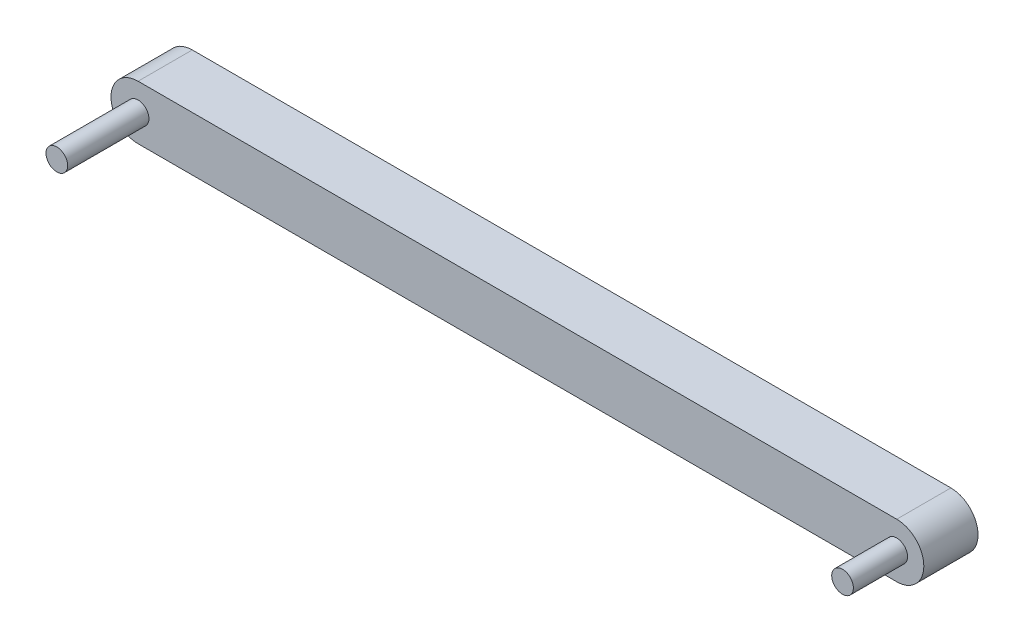
ISO-10303-21;
HEADER;
FILE_DESCRIPTION(('STEP AP214'),'2;1');
FILE_NAME('part.step','',(''),(''),'','','');
FILE_SCHEMA(('AUTOMOTIVE_DESIGN { 1 0 10303 214 1 1 1 1 }'));
ENDSEC;
DATA;
#1=APPLICATION_CONTEXT('core data for automotive mechanical design processes');
#2=APPLICATION_PROTOCOL_DEFINITION('international standard','automotive_design',2000,#1);
#3=PRODUCT_CONTEXT('',#1,'mechanical');
#4=PRODUCT('Part','Part','',(#3));
#5=PRODUCT_RELATED_PRODUCT_CATEGORY('part','',(#4));
#6=PRODUCT_DEFINITION_FORMATION('','',#4);
#7=PRODUCT_DEFINITION_CONTEXT('part definition',#1,'design');
#8=PRODUCT_DEFINITION('design','',#6,#7);
#9=PRODUCT_DEFINITION_SHAPE('','',#8);
#10=(LENGTH_UNIT() NAMED_UNIT(*) SI_UNIT(.MILLI.,.METRE.));
#11=(NAMED_UNIT(*) PLANE_ANGLE_UNIT() SI_UNIT($,.RADIAN.));
#12=(NAMED_UNIT(*) SI_UNIT($,.STERADIAN.) SOLID_ANGLE_UNIT());
#13=UNCERTAINTY_MEASURE_WITH_UNIT(LENGTH_MEASURE(1.E-05),#10,'distance_accuracy_value','');
#14=(GEOMETRIC_REPRESENTATION_CONTEXT(3) GLOBAL_UNCERTAINTY_ASSIGNED_CONTEXT((#13)) GLOBAL_UNIT_ASSIGNED_CONTEXT((#10,
#11,#12)) REPRESENTATION_CONTEXT('',''));
#15=CARTESIAN_POINT('',(0.,0.,0.));
#16=DIRECTION('',(0.,0.,1.));
#17=DIRECTION('',(1.,0.,0.));
#18=AXIS2_PLACEMENT_3D('',#15,#16,#17);
#19=CARTESIAN_POINT('',(0.,50.,100.));
#20=DIRECTION('',(0.,0.,-1.));
#21=DIRECTION('',(-1.,0.,0.));
#22=AXIS2_PLACEMENT_3D('',#19,#20,#21);
#23=CYLINDRICAL_SURFACE('',#22,50.);
#24=CARTESIAN_POINT('',(0.,50.,0.));
#25=DIRECTION('',(0.,0.,1.));
#26=DIRECTION('',(1.,0.,0.));
#27=AXIS2_PLACEMENT_3D('',#24,#25,#26);
#28=CIRCLE('',#27,50.);
#29=CARTESIAN_POINT('',(0.,0.,0.));
#30=VERTEX_POINT('',#29);
#31=CARTESIAN_POINT('',(0.,100.,0.));
#32=VERTEX_POINT('',#31);
#33=EDGE_CURVE('E109',#30,#32,#28,.F.);
#34=ORIENTED_EDGE('',*,*,#33,.F.);
#35=DIRECTION('',(0.,0.,-1.));
#36=VECTOR('',#35,1.);
#37=CARTESIAN_POINT('',(0.,0.,100.));
#38=LINE('',#37,#36);
#39=CARTESIAN_POINT('',(0.,0.,100.));
#40=VERTEX_POINT('',#39);
#41=EDGE_CURVE('E11',#40,#30,#38,.T.);
#42=ORIENTED_EDGE('',*,*,#41,.F.);
#43=CARTESIAN_POINT('',(0.,50.,100.));
#44=DIRECTION('',(0.,0.,1.));
#45=DIRECTION('',(1.,0.,0.));
#46=AXIS2_PLACEMENT_3D('',#43,#44,#45);
#47=CIRCLE('',#46,50.);
#48=CARTESIAN_POINT('',(0.,100.,100.));
#49=VERTEX_POINT('',#48);
#50=EDGE_CURVE('E90',#40,#49,#47,.F.);
#51=ORIENTED_EDGE('',*,*,#50,.T.);
#52=DIRECTION('',(0.,0.,-1.));
#53=VECTOR('',#52,1.);
#54=CARTESIAN_POINT('',(0.,100.,100.));
#55=LINE('',#54,#53);
#56=EDGE_CURVE('E58',#49,#32,#55,.T.);
#57=ORIENTED_EDGE('',*,*,#56,.T.);
#58=EDGE_LOOP('',(#34,#42,#51,#57));
#59=FACE_BOUND('',#58,.T.);
#60=ADVANCED_FACE('F41',(#59),#23,.T.);
#61=CARTESIAN_POINT('',(0.,0.,100.));
#62=DIRECTION('',(0.,1.,0.));
#63=DIRECTION('',(0.,0.,1.));
#64=AXIS2_PLACEMENT_3D('',#61,#62,#63);
#65=PLANE('',#64);
#66=DIRECTION('',(1.,0.,0.));
#67=VECTOR('',#66,1.);
#68=CARTESIAN_POINT('',(0.,0.,0.));
#69=LINE('',#68,#67);
#70=CARTESIAN_POINT('',(1400.,0.,0.));
#71=VERTEX_POINT('',#70);
#72=EDGE_CURVE('E97',#30,#71,#69,.T.);
#73=ORIENTED_EDGE('',*,*,#72,.T.);
#74=DIRECTION('',(0.,0.,-1.));
#75=VECTOR('',#74,1.);
#76=CARTESIAN_POINT('',(1400.,0.,100.));
#77=LINE('',#76,#75);
#78=CARTESIAN_POINT('',(1400.,0.,100.));
#79=VERTEX_POINT('',#78);
#80=EDGE_CURVE('E50',#79,#71,#77,.T.);
#81=ORIENTED_EDGE('',*,*,#80,.F.);
#82=DIRECTION('',(1.,0.,0.));
#83=VECTOR('',#82,1.);
#84=CARTESIAN_POINT('',(0.,0.,100.));
#85=LINE('',#84,#83);
#86=EDGE_CURVE('E84',#40,#79,#85,.T.);
#87=ORIENTED_EDGE('',*,*,#86,.F.);
#88=ORIENTED_EDGE('',*,*,#41,.T.);
#89=EDGE_LOOP('',(#73,#81,#87,#88));
#90=FACE_BOUND('',#89,.T.);
#91=ADVANCED_FACE('F95',(#90),#65,.F.);
#92=CARTESIAN_POINT('',(1400.,50.,100.));
#93=DIRECTION('',(0.,0.,-1.));
#94=DIRECTION('',(-1.,0.,0.));
#95=AXIS2_PLACEMENT_3D('',#92,#93,#94);
#96=CYLINDRICAL_SURFACE('',#95,50.);
#97=CARTESIAN_POINT('',(1400.,50.,0.));
#98=DIRECTION('',(0.,0.,1.));
#99=DIRECTION('',(1.,0.,0.));
#100=AXIS2_PLACEMENT_3D('',#97,#98,#99);
#101=CIRCLE('',#100,50.);
#102=CARTESIAN_POINT('',(1400.,100.,0.));
#103=VERTEX_POINT('',#102);
#104=EDGE_CURVE('E115',#71,#103,#101,.T.);
#105=ORIENTED_EDGE('',*,*,#104,.T.);
#106=DIRECTION('',(0.,0.,-1.));
#107=VECTOR('',#106,1.);
#108=CARTESIAN_POINT('',(1400.,100.,100.));
#109=LINE('',#108,#107);
#110=CARTESIAN_POINT('',(1400.,100.,100.));
#111=VERTEX_POINT('',#110);
#112=EDGE_CURVE('E72',#111,#103,#109,.T.);
#113=ORIENTED_EDGE('',*,*,#112,.F.);
#114=CARTESIAN_POINT('',(1400.,50.,100.));
#115=DIRECTION('',(0.,0.,1.));
#116=DIRECTION('',(1.,0.,0.));
#117=AXIS2_PLACEMENT_3D('',#114,#115,#116);
#118=CIRCLE('',#117,50.);
#119=EDGE_CURVE('E89',#79,#111,#118,.T.);
#120=ORIENTED_EDGE('',*,*,#119,.F.);
#121=ORIENTED_EDGE('',*,*,#80,.T.);
#122=EDGE_LOOP('',(#105,#113,#120,#121));
#123=FACE_BOUND('',#122,.T.);
#124=ADVANCED_FACE('F101',(#123),#96,.T.);
#125=CARTESIAN_POINT('',(0.,100.,100.));
#126=DIRECTION('',(0.,1.,0.));
#127=DIRECTION('',(0.,0.,1.));
#128=AXIS2_PLACEMENT_3D('',#125,#126,#127);
#129=PLANE('',#128);
#130=DIRECTION('',(1.,0.,0.));
#131=VECTOR('',#130,1.);
#132=CARTESIAN_POINT('',(0.,100.,0.));
#133=LINE('',#132,#131);
#134=EDGE_CURVE('E118',#32,#103,#133,.T.);
#135=ORIENTED_EDGE('',*,*,#134,.F.);
#136=ORIENTED_EDGE('',*,*,#56,.F.);
#137=DIRECTION('',(1.,0.,0.));
#138=VECTOR('',#137,1.);
#139=CARTESIAN_POINT('',(0.,100.,100.));
#140=LINE('',#139,#138);
#141=EDGE_CURVE('E103',#49,#111,#140,.T.);
#142=ORIENTED_EDGE('',*,*,#141,.T.);
#143=ORIENTED_EDGE('',*,*,#112,.T.);
#144=EDGE_LOOP('',(#135,#136,#142,#143));
#145=FACE_BOUND('',#144,.T.);
#146=ADVANCED_FACE('F156',(#145),#129,.T.);
#147=CARTESIAN_POINT('',(0.,0.,100.));
#148=DIRECTION('',(0.,0.,1.));
#149=DIRECTION('',(1.,0.,0.));
#150=AXIS2_PLACEMENT_3D('',#147,#148,#149);
#151=PLANE('',#150);
#152=CARTESIAN_POINT('',(1400.,50.,100.));
#153=DIRECTION('',(0.,0.,1.));
#154=DIRECTION('',(1.,0.,0.));
#155=AXIS2_PLACEMENT_3D('',#152,#153,#154);
#156=CIRCLE('',#155,20.);
#157=CARTESIAN_POINT('',(1420.,50.,100.));
#158=VERTEX_POINT('',#157);
#159=EDGE_CURVE('E136',#158,#158,#156,.T.);
#160=ORIENTED_EDGE('',*,*,#159,.F.);
#161=EDGE_LOOP('',(#160));
#162=FACE_BOUND('',#161,.T.);
#163=CARTESIAN_POINT('',(0.,50.0000000000004,100.));
#164=DIRECTION('',(0.,0.,1.));
#165=DIRECTION('',(1.,0.,0.));
#166=AXIS2_PLACEMENT_3D('',#163,#164,#165);
#167=CIRCLE('',#166,20.);
#168=CARTESIAN_POINT('',(20.,50.0000000000004,100.));
#169=VERTEX_POINT('',#168);
#170=EDGE_CURVE('E128',#169,#169,#167,.T.);
#171=ORIENTED_EDGE('',*,*,#170,.F.);
#172=EDGE_LOOP('',(#171));
#173=FACE_BOUND('',#172,.T.);
#174=ORIENTED_EDGE('',*,*,#50,.F.);
#175=ORIENTED_EDGE('',*,*,#86,.T.);
#176=ORIENTED_EDGE('',*,*,#119,.T.);
#177=ORIENTED_EDGE('',*,*,#141,.F.);
#178=EDGE_LOOP('',(#174,#175,#176,#177));
#179=FACE_BOUND('',#178,.T.);
#180=ADVANCED_FACE('F86',(#162,#173,#179),#151,.T.);
#181=CARTESIAN_POINT('',(0.,0.,0.));
#182=DIRECTION('',(0.,0.,1.));
#183=DIRECTION('',(1.,0.,0.));
#184=AXIS2_PLACEMENT_3D('',#181,#182,#183);
#185=PLANE('',#184);
#186=ORIENTED_EDGE('',*,*,#33,.T.);
#187=ORIENTED_EDGE('',*,*,#134,.T.);
#188=ORIENTED_EDGE('',*,*,#104,.F.);
#189=ORIENTED_EDGE('',*,*,#72,.F.);
#190=EDGE_LOOP('',(#186,#187,#188,#189));
#191=FACE_BOUND('',#190,.T.);
#192=ADVANCED_FACE('F155',(#191),#185,.F.);
#193=CARTESIAN_POINT('',(0.,50.0000000000004,250.));
#194=DIRECTION('',(0.,0.,-1.));
#195=DIRECTION('',(-1.,0.,0.));
#196=AXIS2_PLACEMENT_3D('',#193,#194,#195);
#197=CYLINDRICAL_SURFACE('',#196,20.);
#198=CARTESIAN_POINT('',(0.,50.0000000000004,250.));
#199=DIRECTION('',(0.,0.,1.));
#200=DIRECTION('',(1.,0.,0.));
#201=AXIS2_PLACEMENT_3D('',#198,#199,#200);
#202=CIRCLE('',#201,20.);
#203=CARTESIAN_POINT('',(20.,50.0000000000004,250.));
#204=VERTEX_POINT('',#203);
#205=EDGE_CURVE('E112',#204,#204,#202,.T.);
#206=ORIENTED_EDGE('',*,*,#205,.F.);
#207=EDGE_LOOP('',(#206));
#208=FACE_BOUND('',#207,.T.);
#209=ORIENTED_EDGE('',*,*,#170,.T.);
#210=EDGE_LOOP('',(#209));
#211=FACE_BOUND('',#210,.T.);
#212=ADVANCED_FACE('F160',(#208,#211),#197,.T.);
#213=CARTESIAN_POINT('',(0.,50.0000000000004,250.));
#214=DIRECTION('',(0.,0.,1.));
#215=DIRECTION('',(1.,0.,0.));
#216=AXIS2_PLACEMENT_3D('',#213,#214,#215);
#217=PLANE('',#216);
#218=ORIENTED_EDGE('',*,*,#205,.T.);
#219=EDGE_LOOP('',(#218));
#220=FACE_BOUND('',#219,.T.);
#221=ADVANCED_FACE('F149',(#220),#217,.T.);
#222=CARTESIAN_POINT('',(1400.,50.,200.));
#223=DIRECTION('',(0.,0.,-1.));
#224=DIRECTION('',(-1.,0.,0.));
#225=AXIS2_PLACEMENT_3D('',#222,#223,#224);
#226=CYLINDRICAL_SURFACE('',#225,20.);
#227=CARTESIAN_POINT('',(1400.,50.,200.));
#228=DIRECTION('',(0.,0.,1.));
#229=DIRECTION('',(1.,0.,0.));
#230=AXIS2_PLACEMENT_3D('',#227,#228,#229);
#231=CIRCLE('',#230,20.);
#232=CARTESIAN_POINT('',(1420.,50.,200.));
#233=VERTEX_POINT('',#232);
#234=EDGE_CURVE('E132',#233,#233,#231,.T.);
#235=ORIENTED_EDGE('',*,*,#234,.F.);
#236=EDGE_LOOP('',(#235));
#237=FACE_BOUND('',#236,.T.);
#238=ORIENTED_EDGE('',*,*,#159,.T.);
#239=EDGE_LOOP('',(#238));
#240=FACE_BOUND('',#239,.T.);
#241=ADVANCED_FACE('F146',(#237,#240),#226,.T.);
#242=CARTESIAN_POINT('',(0.,0.,200.));
#243=DIRECTION('',(0.,0.,1.));
#244=DIRECTION('',(1.,0.,0.));
#245=AXIS2_PLACEMENT_3D('',#242,#243,#244);
#246=PLANE('',#245);
#247=ORIENTED_EDGE('',*,*,#234,.T.);
#248=EDGE_LOOP('',(#247));
#249=FACE_BOUND('',#248,.T.);
#250=ADVANCED_FACE('F144',(#249),#246,.T.);
#251=CLOSED_SHELL('',(#60,#91,#124,#146,#180,#192,#212,#221,#241,#250));
#252=MANIFOLD_SOLID_BREP('B2',#251);
#253=ADVANCED_BREP_SHAPE_REPRESENTATION('',(#18,#252),#14);
#254=SHAPE_DEFINITION_REPRESENTATION(#9,#253);
ENDSEC;
END-ISO-10303-21;
